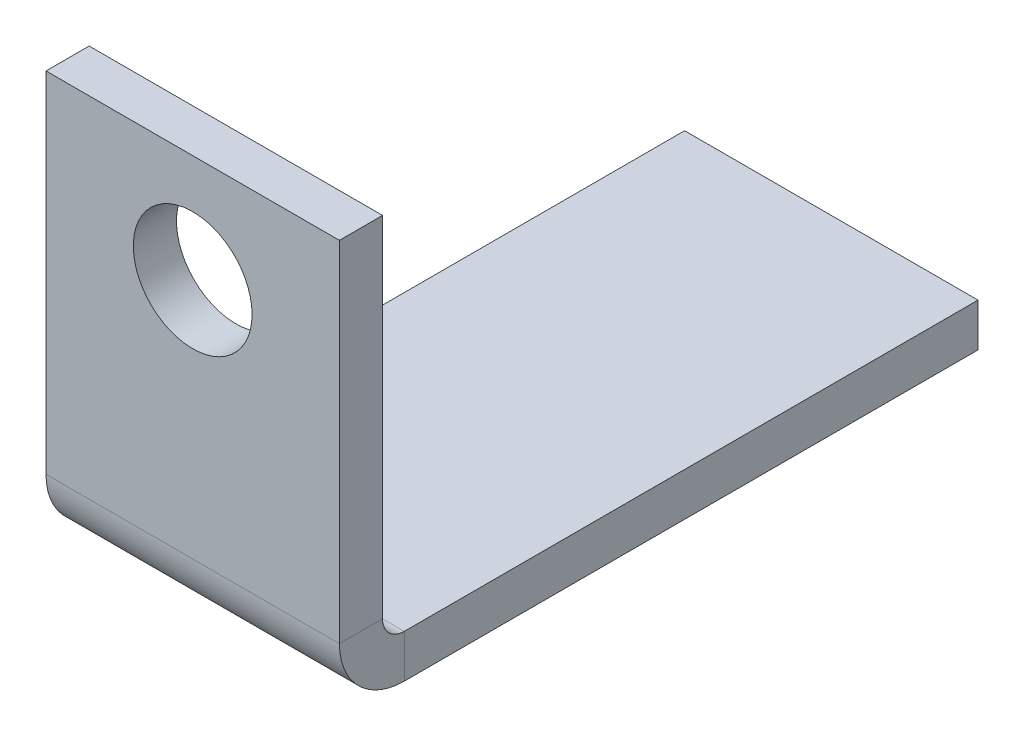
ISO-10303-21;
HEADER;
FILE_DESCRIPTION(('STEP AP214'),'2;1');
FILE_NAME('part.step','',(''),(''),'','','');
FILE_SCHEMA(('AUTOMOTIVE_DESIGN { 1 0 10303 214 1 1 1 1 }'));
ENDSEC;
DATA;
#1=APPLICATION_CONTEXT('core data for automotive mechanical design processes');
#2=APPLICATION_PROTOCOL_DEFINITION('international standard','automotive_design',2000,#1);
#3=PRODUCT_CONTEXT('',#1,'mechanical');
#4=PRODUCT('Part','Part','',(#3));
#5=PRODUCT_RELATED_PRODUCT_CATEGORY('part','',(#4));
#6=PRODUCT_DEFINITION_FORMATION('','',#4);
#7=PRODUCT_DEFINITION_CONTEXT('part definition',#1,'design');
#8=PRODUCT_DEFINITION('design','',#6,#7);
#9=PRODUCT_DEFINITION_SHAPE('','',#8);
#10=(LENGTH_UNIT() NAMED_UNIT(*) SI_UNIT(.MILLI.,.METRE.));
#11=(NAMED_UNIT(*) PLANE_ANGLE_UNIT() SI_UNIT($,.RADIAN.));
#12=(NAMED_UNIT(*) SI_UNIT($,.STERADIAN.) SOLID_ANGLE_UNIT());
#13=UNCERTAINTY_MEASURE_WITH_UNIT(LENGTH_MEASURE(1.E-05),#10,'distance_accuracy_value','');
#14=(GEOMETRIC_REPRESENTATION_CONTEXT(3) GLOBAL_UNCERTAINTY_ASSIGNED_CONTEXT((#13)) GLOBAL_UNIT_ASSIGNED_CONTEXT((#10,
#11,#12)) REPRESENTATION_CONTEXT('',''));
#15=CARTESIAN_POINT('',(0.,0.,0.));
#16=DIRECTION('',(0.,0.,1.));
#17=DIRECTION('',(1.,0.,0.));
#18=AXIS2_PLACEMENT_3D('',#15,#16,#17);
#19=CARTESIAN_POINT('',(-10.795,15.24,3.175));
#20=DIRECTION('',(-1.,0.,0.));
#21=DIRECTION('',(0.,-1.,0.));
#22=AXIS2_PLACEMENT_3D('',#19,#20,#21);
#23=PLANE('',#22);
#24=DIRECTION('',(0.,1.,0.));
#25=VECTOR('',#24,1.);
#26=CARTESIAN_POINT('',(-10.795,0.,0.));
#27=LINE('',#26,#25);
#28=CARTESIAN_POINT('',(-10.795,15.24,0.));
#29=VERTEX_POINT('',#28);
#30=CARTESIAN_POINT('',(-10.795,-10.464999898,0.));
#31=VERTEX_POINT('',#30);
#32=EDGE_CURVE('E191',#29,#31,#27,.F.);
#33=ORIENTED_EDGE('',*,*,#32,.T.);
#34=DIRECTION('',(0.,0.,1.));
#35=VECTOR('',#34,1.);
#36=CARTESIAN_POINT('',(-10.795,-10.464999898,0.));
#37=LINE('',#36,#35);
#38=CARTESIAN_POINT('',(-10.795,-10.464999898,3.175));
#39=VERTEX_POINT('',#38);
#40=EDGE_CURVE('E141',#31,#39,#37,.T.);
#41=ORIENTED_EDGE('',*,*,#40,.T.);
#42=DIRECTION('',(0.,-1.,0.));
#43=VECTOR('',#42,1.);
#44=CARTESIAN_POINT('',(-10.795,15.24,3.175));
#45=LINE('',#44,#43);
#46=CARTESIAN_POINT('',(-10.795,15.24,3.175));
#47=VERTEX_POINT('',#46);
#48=EDGE_CURVE('E183',#47,#39,#45,.T.);
#49=ORIENTED_EDGE('',*,*,#48,.F.);
#50=DIRECTION('',(0.,0.,1.));
#51=VECTOR('',#50,1.);
#52=CARTESIAN_POINT('',(-10.795,15.24,3.175));
#53=LINE('',#52,#51);
#54=EDGE_CURVE('E13',#29,#47,#53,.T.);
#55=ORIENTED_EDGE('',*,*,#54,.F.);
#56=EDGE_LOOP('',(#33,#41,#49,#55));
#57=FACE_BOUND('',#56,.T.);
#58=ADVANCED_FACE('F59',(#57),#23,.T.);
#59=CARTESIAN_POINT('',(0.,0.,3.175));
#60=DIRECTION('',(0.,0.,1.));
#61=DIRECTION('',(1.,0.,0.));
#62=AXIS2_PLACEMENT_3D('',#59,#60,#61);
#63=PLANE('',#62);
#64=CARTESIAN_POINT('',(0.,7.3025,3.175));
#65=DIRECTION('',(0.,0.,1.));
#66=DIRECTION('',(1.,0.,0.));
#67=AXIS2_PLACEMENT_3D('',#64,#65,#66);
#68=CIRCLE('',#67,4.3688);
#69=CARTESIAN_POINT('',(4.3688,7.3025,3.175));
#70=VERTEX_POINT('',#69);
#71=EDGE_CURVE('E186',#70,#70,#68,.T.);
#72=ORIENTED_EDGE('',*,*,#71,.F.);
#73=EDGE_LOOP('',(#72));
#74=FACE_BOUND('',#73,.T.);
#75=ORIENTED_EDGE('',*,*,#48,.T.);
#76=DIRECTION('',(-1.,0.,0.));
#77=VECTOR('',#76,1.);
#78=CARTESIAN_POINT('',(-10.795,-10.464999898,3.175));
#79=LINE('',#78,#77);
#80=CARTESIAN_POINT('',(10.795,-10.464999898,3.175));
#81=VERTEX_POINT('',#80);
#82=EDGE_CURVE('E101',#39,#81,#79,.F.);
#83=ORIENTED_EDGE('',*,*,#82,.T.);
#84=DIRECTION('',(0.,1.,0.));
#85=VECTOR('',#84,1.);
#86=CARTESIAN_POINT('',(10.795,15.24,3.175));
#87=LINE('',#86,#85);
#88=CARTESIAN_POINT('',(10.795,15.24,3.175));
#89=VERTEX_POINT('',#88);
#90=EDGE_CURVE('E178',#81,#89,#87,.T.);
#91=ORIENTED_EDGE('',*,*,#90,.T.);
#92=DIRECTION('',(-1.,0.,0.));
#93=VECTOR('',#92,1.);
#94=CARTESIAN_POINT('',(-10.795,15.24,3.175));
#95=LINE('',#94,#93);
#96=EDGE_CURVE('E180',#89,#47,#95,.T.);
#97=ORIENTED_EDGE('',*,*,#96,.T.);
#98=EDGE_LOOP('',(#75,#83,#91,#97));
#99=FACE_BOUND('',#98,.T.);
#100=ADVANCED_FACE('F214',(#74,#99),#63,.T.);
#101=CARTESIAN_POINT('',(0.,0.,0.));
#102=DIRECTION('',(0.,0.,1.));
#103=DIRECTION('',(1.,0.,0.));
#104=AXIS2_PLACEMENT_3D('',#101,#102,#103);
#105=PLANE('',#104);
#106=CARTESIAN_POINT('',(0.,7.3025,0.));
#107=DIRECTION('',(0.,0.,1.));
#108=DIRECTION('',(1.,0.,0.));
#109=AXIS2_PLACEMENT_3D('',#106,#107,#108);
#110=CIRCLE('',#109,4.3688);
#111=CARTESIAN_POINT('',(4.3688,7.3025,0.));
#112=VERTEX_POINT('',#111);
#113=EDGE_CURVE('E181',#112,#112,#110,.T.);
#114=ORIENTED_EDGE('',*,*,#113,.T.);
#115=EDGE_LOOP('',(#114));
#116=FACE_BOUND('',#115,.T.);
#117=DIRECTION('',(-1.,0.,0.));
#118=VECTOR('',#117,1.);
#119=CARTESIAN_POINT('',(-10.795,-10.464999898,0.));
#120=LINE('',#119,#118);
#121=CARTESIAN_POINT('',(10.795,-10.464999898,0.));
#122=VERTEX_POINT('',#121);
#123=EDGE_CURVE('E142',#31,#122,#120,.F.);
#124=ORIENTED_EDGE('',*,*,#123,.F.);
#125=ORIENTED_EDGE('',*,*,#32,.F.);
#126=DIRECTION('',(1.,0.,0.));
#127=VECTOR('',#126,1.);
#128=CARTESIAN_POINT('',(0.,15.24,0.));
#129=LINE('',#128,#127);
#130=CARTESIAN_POINT('',(10.795,15.24,0.));
#131=VERTEX_POINT('',#130);
#132=EDGE_CURVE('E190',#131,#29,#129,.F.);
#133=ORIENTED_EDGE('',*,*,#132,.F.);
#134=DIRECTION('',(0.,1.,0.));
#135=VECTOR('',#134,1.);
#136=CARTESIAN_POINT('',(10.795,0.,0.));
#137=LINE('',#136,#135);
#138=EDGE_CURVE('E95',#122,#131,#137,.T.);
#139=ORIENTED_EDGE('',*,*,#138,.F.);
#140=EDGE_LOOP('',(#124,#125,#133,#139));
#141=FACE_BOUND('',#140,.T.);
#142=ADVANCED_FACE('F198',(#116,#141),#105,.F.);
#143=CARTESIAN_POINT('',(10.795,15.24,3.175));
#144=DIRECTION('',(1.,0.,0.));
#145=DIRECTION('',(0.,1.,0.));
#146=AXIS2_PLACEMENT_3D('',#143,#144,#145);
#147=PLANE('',#146);
#148=DIRECTION('',(0.,0.,1.));
#149=VECTOR('',#148,1.);
#150=CARTESIAN_POINT('',(10.795,-10.464999898,0.));
#151=LINE('',#150,#149);
#152=EDGE_CURVE('E175',#122,#81,#151,.T.);
#153=ORIENTED_EDGE('',*,*,#152,.F.);
#154=ORIENTED_EDGE('',*,*,#138,.T.);
#155=DIRECTION('',(0.,0.,1.));
#156=VECTOR('',#155,1.);
#157=CARTESIAN_POINT('',(10.795,15.24,3.175));
#158=LINE('',#157,#156);
#159=EDGE_CURVE('E63',#131,#89,#158,.T.);
#160=ORIENTED_EDGE('',*,*,#159,.T.);
#161=ORIENTED_EDGE('',*,*,#90,.F.);
#162=EDGE_LOOP('',(#153,#154,#160,#161));
#163=FACE_BOUND('',#162,.T.);
#164=ADVANCED_FACE('F212',(#163),#147,.T.);
#165=CARTESIAN_POINT('',(-10.795,15.24,3.175));
#166=DIRECTION('',(0.,1.,0.));
#167=DIRECTION('',(-1.,0.,0.));
#168=AXIS2_PLACEMENT_3D('',#165,#166,#167);
#169=PLANE('',#168);
#170=ORIENTED_EDGE('',*,*,#132,.T.);
#171=ORIENTED_EDGE('',*,*,#54,.T.);
#172=ORIENTED_EDGE('',*,*,#96,.F.);
#173=ORIENTED_EDGE('',*,*,#159,.F.);
#174=EDGE_LOOP('',(#170,#171,#172,#173));
#175=FACE_BOUND('',#174,.T.);
#176=ADVANCED_FACE('F203',(#175),#169,.T.);
#177=CARTESIAN_POINT('',(0.,7.3025,3.175));
#178=DIRECTION('',(0.,0.,1.));
#179=DIRECTION('',(1.,0.,0.));
#180=AXIS2_PLACEMENT_3D('',#177,#178,#179);
#181=CYLINDRICAL_SURFACE('',#180,4.3688);
#182=ORIENTED_EDGE('',*,*,#71,.T.);
#183=EDGE_LOOP('',(#182));
#184=FACE_BOUND('',#183,.T.);
#185=ORIENTED_EDGE('',*,*,#113,.F.);
#186=EDGE_LOOP('',(#185));
#187=FACE_BOUND('',#186,.T.);
#188=ADVANCED_FACE('F61',(#184,#187),#181,.F.);
#189=CARTESIAN_POINT('',(10.795,-10.464999898,-1.600000102));
#190=DIRECTION('',(1.,0.,0.));
#191=DIRECTION('',(0.,0.,-1.));
#192=AXIS2_PLACEMENT_3D('',#189,#190,#191);
#193=PLANE('',#192);
#194=DIRECTION('',(0.,-1.,0.));
#195=VECTOR('',#194,1.);
#196=CARTESIAN_POINT('',(10.795,-15.24,-1.60000010199998));
#197=LINE('',#196,#195);
#198=CARTESIAN_POINT('',(10.795,-12.065,-1.60000010199999));
#199=VERTEX_POINT('',#198);
#200=CARTESIAN_POINT('',(10.795,-15.24,-1.60000010199998));
#201=VERTEX_POINT('',#200);
#202=EDGE_CURVE('E133',#199,#201,#197,.T.);
#203=ORIENTED_EDGE('',*,*,#202,.F.);
#204=CARTESIAN_POINT('',(10.795,-10.464999898,-1.600000102));
#205=DIRECTION('',(-1.,0.,0.));
#206=DIRECTION('',(0.,0.,1.));
#207=AXIS2_PLACEMENT_3D('',#204,#205,#206);
#208=CIRCLE('',#207,1.600000102);
#209=EDGE_CURVE('E127',#122,#199,#208,.F.);
#210=ORIENTED_EDGE('',*,*,#209,.F.);
#211=ORIENTED_EDGE('',*,*,#152,.T.);
#212=CARTESIAN_POINT('',(10.795,-10.464999898,-1.600000102));
#213=DIRECTION('',(-1.,0.,0.));
#214=DIRECTION('',(0.,0.,1.));
#215=AXIS2_PLACEMENT_3D('',#212,#213,#214);
#216=CIRCLE('',#215,4.775000102);
#217=EDGE_CURVE('E74',#81,#201,#216,.F.);
#218=ORIENTED_EDGE('',*,*,#217,.T.);
#219=EDGE_LOOP('',(#203,#210,#211,#218));
#220=FACE_BOUND('',#219,.T.);
#221=ADVANCED_FACE('F202',(#220),#193,.T.);
#222=CARTESIAN_POINT('',(-10.795,-10.464999898,-1.600000102));
#223=DIRECTION('',(1.,0.,0.));
#224=DIRECTION('',(0.,0.,-1.));
#225=AXIS2_PLACEMENT_3D('',#222,#223,#224);
#226=PLANE('',#225);
#227=CARTESIAN_POINT('',(-10.795,-10.464999898,-1.600000102));
#228=DIRECTION('',(-1.,0.,0.));
#229=DIRECTION('',(0.,0.,1.));
#230=AXIS2_PLACEMENT_3D('',#227,#228,#229);
#231=CIRCLE('',#230,1.600000102);
#232=CARTESIAN_POINT('',(-10.795,-12.065,-1.60000010199999));
#233=VERTEX_POINT('',#232);
#234=EDGE_CURVE('E124',#233,#31,#231,.T.);
#235=ORIENTED_EDGE('',*,*,#234,.F.);
#236=DIRECTION('',(0.,-1.,0.));
#237=VECTOR('',#236,1.);
#238=CARTESIAN_POINT('',(-10.795,-12.065,-1.60000010199999));
#239=LINE('',#238,#237);
#240=CARTESIAN_POINT('',(-10.795,-15.24,-1.60000010199998));
#241=VERTEX_POINT('',#240);
#242=EDGE_CURVE('E132',#233,#241,#239,.T.);
#243=ORIENTED_EDGE('',*,*,#242,.T.);
#244=CARTESIAN_POINT('',(-10.795,-10.464999898,-1.600000102));
#245=DIRECTION('',(-1.,0.,0.));
#246=DIRECTION('',(0.,0.,1.));
#247=AXIS2_PLACEMENT_3D('',#244,#245,#246);
#248=CIRCLE('',#247,4.775000102);
#249=EDGE_CURVE('E170',#241,#39,#248,.T.);
#250=ORIENTED_EDGE('',*,*,#249,.T.);
#251=ORIENTED_EDGE('',*,*,#40,.F.);
#252=EDGE_LOOP('',(#235,#243,#250,#251));
#253=FACE_BOUND('',#252,.T.);
#254=ADVANCED_FACE('F137',(#253),#226,.F.);
#255=CARTESIAN_POINT('',(-10.795,-10.464999898,-1.600000102));
#256=DIRECTION('',(-1.,0.,0.));
#257=DIRECTION('',(0.,-1.,0.));
#258=AXIS2_PLACEMENT_3D('',#255,#256,#257);
#259=CYLINDRICAL_SURFACE('',#258,4.775000102);
#260=ORIENTED_EDGE('',*,*,#82,.F.);
#261=ORIENTED_EDGE('',*,*,#249,.F.);
#262=DIRECTION('',(-1.,0.,0.));
#263=VECTOR('',#262,1.);
#264=CARTESIAN_POINT('',(0.,-15.24,-1.60000010199998));
#265=LINE('',#264,#263);
#266=EDGE_CURVE('E161',#201,#241,#265,.T.);
#267=ORIENTED_EDGE('',*,*,#266,.F.);
#268=ORIENTED_EDGE('',*,*,#217,.F.);
#269=EDGE_LOOP('',(#260,#261,#267,#268));
#270=FACE_BOUND('',#269,.T.);
#271=ADVANCED_FACE('F228',(#270),#259,.T.);
#272=CARTESIAN_POINT('',(-10.795,-10.464999898,-1.600000102));
#273=DIRECTION('',(-1.,0.,0.));
#274=DIRECTION('',(0.,-1.,0.));
#275=AXIS2_PLACEMENT_3D('',#272,#273,#274);
#276=CYLINDRICAL_SURFACE('',#275,1.600000102);
#277=ORIENTED_EDGE('',*,*,#123,.T.);
#278=ORIENTED_EDGE('',*,*,#209,.T.);
#279=DIRECTION('',(1.,0.,0.));
#280=VECTOR('',#279,1.);
#281=CARTESIAN_POINT('',(10.795,-12.065,-1.60000010199999));
#282=LINE('',#281,#280);
#283=EDGE_CURVE('E121',#199,#233,#282,.F.);
#284=ORIENTED_EDGE('',*,*,#283,.T.);
#285=ORIENTED_EDGE('',*,*,#234,.T.);
#286=EDGE_LOOP('',(#277,#278,#284,#285));
#287=FACE_BOUND('',#286,.T.);
#288=ADVANCED_FACE('F123',(#287),#276,.F.);
#289=CARTESIAN_POINT('',(-10.795,-15.24,0.));
#290=DIRECTION('',(-1.,0.,0.));
#291=DIRECTION('',(0.,0.,1.));
#292=AXIS2_PLACEMENT_3D('',#289,#290,#291);
#293=PLANE('',#292);
#294=DIRECTION('',(0.,0.,1.));
#295=VECTOR('',#294,1.);
#296=CARTESIAN_POINT('',(-10.795,-15.24,0.));
#297=LINE('',#296,#295);
#298=CARTESIAN_POINT('',(-10.795,-15.2400000000001,-43.815));
#299=VERTEX_POINT('',#298);
#300=EDGE_CURVE('E160',#299,#241,#297,.T.);
#301=ORIENTED_EDGE('',*,*,#300,.T.);
#302=ORIENTED_EDGE('',*,*,#242,.F.);
#303=DIRECTION('',(0.,0.,-1.));
#304=VECTOR('',#303,1.);
#305=CARTESIAN_POINT('',(-10.795,-12.065,0.));
#306=LINE('',#305,#304);
#307=CARTESIAN_POINT('',(-10.795,-12.0650000000001,-43.815));
#308=VERTEX_POINT('',#307);
#309=EDGE_CURVE('E147',#308,#233,#306,.F.);
#310=ORIENTED_EDGE('',*,*,#309,.F.);
#311=DIRECTION('',(0.,1.,0.));
#312=VECTOR('',#311,1.);
#313=CARTESIAN_POINT('',(-10.795,-15.2400000000001,-43.815));
#314=LINE('',#313,#312);
#315=EDGE_CURVE('E143',#299,#308,#314,.T.);
#316=ORIENTED_EDGE('',*,*,#315,.F.);
#317=EDGE_LOOP('',(#301,#302,#310,#316));
#318=FACE_BOUND('',#317,.T.);
#319=ADVANCED_FACE('F158',(#318),#293,.T.);
#320=CARTESIAN_POINT('',(10.795,-15.2400000000001,-43.815));
#321=DIRECTION('',(1.,0.,0.));
#322=DIRECTION('',(0.,0.,-1.));
#323=AXIS2_PLACEMENT_3D('',#320,#321,#322);
#324=PLANE('',#323);
#325=DIRECTION('',(0.,0.,1.));
#326=VECTOR('',#325,1.);
#327=CARTESIAN_POINT('',(10.795,-12.065,0.));
#328=LINE('',#327,#326);
#329=CARTESIAN_POINT('',(10.795,-12.0650000000001,-43.815));
#330=VERTEX_POINT('',#329);
#331=EDGE_CURVE('E163',#199,#330,#328,.F.);
#332=ORIENTED_EDGE('',*,*,#331,.F.);
#333=ORIENTED_EDGE('',*,*,#202,.T.);
#334=DIRECTION('',(0.,0.,-1.));
#335=VECTOR('',#334,1.);
#336=CARTESIAN_POINT('',(10.795,-15.2400000000001,-43.815));
#337=LINE('',#336,#335);
#338=CARTESIAN_POINT('',(10.795,-15.2400000000001,-43.815));
#339=VERTEX_POINT('',#338);
#340=EDGE_CURVE('E155',#201,#339,#337,.T.);
#341=ORIENTED_EDGE('',*,*,#340,.T.);
#342=DIRECTION('',(0.,1.,0.));
#343=VECTOR('',#342,1.);
#344=CARTESIAN_POINT('',(10.795,-15.2400000000001,-43.815));
#345=LINE('',#344,#343);
#346=EDGE_CURVE('E264',#339,#330,#345,.T.);
#347=ORIENTED_EDGE('',*,*,#346,.T.);
#348=EDGE_LOOP('',(#332,#333,#341,#347));
#349=FACE_BOUND('',#348,.T.);
#350=ADVANCED_FACE('F234',(#349),#324,.T.);
#351=CARTESIAN_POINT('',(0.,-15.24,0.));
#352=DIRECTION('',(0.,-1.,0.));
#353=DIRECTION('',(0.,0.,-1.));
#354=AXIS2_PLACEMENT_3D('',#351,#352,#353);
#355=PLANE('',#354);
#356=ORIENTED_EDGE('',*,*,#340,.F.);
#357=ORIENTED_EDGE('',*,*,#266,.T.);
#358=ORIENTED_EDGE('',*,*,#300,.F.);
#359=DIRECTION('',(-1.,0.,0.));
#360=VECTOR('',#359,1.);
#361=CARTESIAN_POINT('',(-10.795,-15.2400000000001,-43.815));
#362=LINE('',#361,#360);
#363=EDGE_CURVE('E256',#339,#299,#362,.T.);
#364=ORIENTED_EDGE('',*,*,#363,.F.);
#365=EDGE_LOOP('',(#356,#357,#358,#364));
#366=FACE_BOUND('',#365,.T.);
#367=ADVANCED_FACE('F237',(#366),#355,.T.);
#368=CARTESIAN_POINT('',(0.,-12.065,0.));
#369=DIRECTION('',(0.,-1.,0.));
#370=DIRECTION('',(0.,0.,-1.));
#371=AXIS2_PLACEMENT_3D('',#368,#369,#370);
#372=PLANE('',#371);
#373=ORIENTED_EDGE('',*,*,#283,.F.);
#374=ORIENTED_EDGE('',*,*,#331,.T.);
#375=DIRECTION('',(1.,0.,0.));
#376=VECTOR('',#375,1.);
#377=CARTESIAN_POINT('',(0.,-12.0650000000001,-43.815));
#378=LINE('',#377,#376);
#379=EDGE_CURVE('E151',#330,#308,#378,.F.);
#380=ORIENTED_EDGE('',*,*,#379,.T.);
#381=ORIENTED_EDGE('',*,*,#309,.T.);
#382=EDGE_LOOP('',(#373,#374,#380,#381));
#383=FACE_BOUND('',#382,.T.);
#384=ADVANCED_FACE('F148',(#383),#372,.F.);
#385=CARTESIAN_POINT('',(-10.795,-15.2400000000001,-43.815));
#386=DIRECTION('',(0.,0.,-1.));
#387=DIRECTION('',(0.,1.,0.));
#388=AXIS2_PLACEMENT_3D('',#385,#386,#387);
#389=PLANE('',#388);
#390=ORIENTED_EDGE('',*,*,#379,.F.);
#391=ORIENTED_EDGE('',*,*,#346,.F.);
#392=ORIENTED_EDGE('',*,*,#363,.T.);
#393=ORIENTED_EDGE('',*,*,#315,.T.);
#394=EDGE_LOOP('',(#390,#391,#392,#393));
#395=FACE_BOUND('',#394,.T.);
#396=ADVANCED_FACE('F239',(#395),#389,.T.);
#397=CLOSED_SHELL('',(#58,#100,#142,#164,#176,#188,#221,#254,#271,#288,#319,#350,#367,#384,#396));
#398=MANIFOLD_SOLID_BREP('B2',#397);
#399=ADVANCED_BREP_SHAPE_REPRESENTATION('',(#18,#398),#14);
#400=SHAPE_DEFINITION_REPRESENTATION(#9,#399);
ENDSEC;
END-ISO-10303-21;
